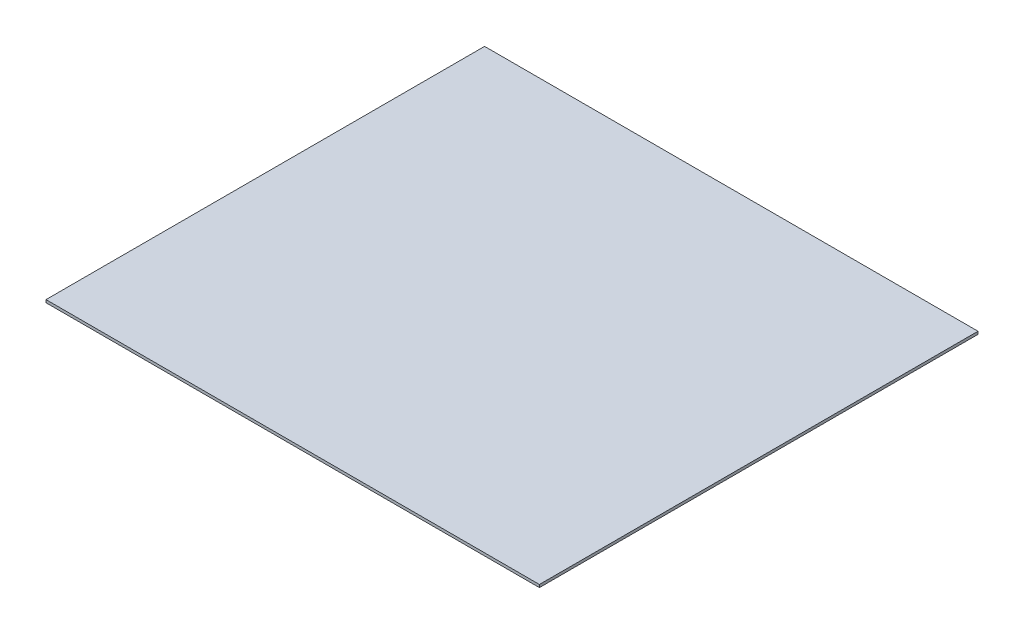
ISO-10303-21;
HEADER;
FILE_DESCRIPTION(('STEP AP214'),'2;1');
FILE_NAME('part.step','',(''),(''),'','','');
FILE_SCHEMA(('AUTOMOTIVE_DESIGN { 1 0 10303 214 1 1 1 1 }'));
ENDSEC;
DATA;
#1=APPLICATION_CONTEXT('core data for automotive mechanical design processes');
#2=APPLICATION_PROTOCOL_DEFINITION('international standard','automotive_design',2000,#1);
#3=PRODUCT_CONTEXT('',#1,'mechanical');
#4=PRODUCT('Part','Part','',(#3));
#5=PRODUCT_RELATED_PRODUCT_CATEGORY('part','',(#4));
#6=PRODUCT_DEFINITION_FORMATION('','',#4);
#7=PRODUCT_DEFINITION_CONTEXT('part definition',#1,'design');
#8=PRODUCT_DEFINITION('design','',#6,#7);
#9=PRODUCT_DEFINITION_SHAPE('','',#8);
#10=(LENGTH_UNIT() NAMED_UNIT(*) SI_UNIT(.MILLI.,.METRE.));
#11=(NAMED_UNIT(*) PLANE_ANGLE_UNIT() SI_UNIT($,.RADIAN.));
#12=(NAMED_UNIT(*) SI_UNIT($,.STERADIAN.) SOLID_ANGLE_UNIT());
#13=UNCERTAINTY_MEASURE_WITH_UNIT(LENGTH_MEASURE(1.E-05),#10,'distance_accuracy_value','');
#14=(GEOMETRIC_REPRESENTATION_CONTEXT(3) GLOBAL_UNCERTAINTY_ASSIGNED_CONTEXT((#13)) GLOBAL_UNIT_ASSIGNED_CONTEXT((#10,
#11,#12)) REPRESENTATION_CONTEXT('',''));
#15=CARTESIAN_POINT('',(0.,0.,0.));
#16=DIRECTION('',(0.,0.,1.));
#17=DIRECTION('',(1.,0.,0.));
#18=AXIS2_PLACEMENT_3D('',#15,#16,#17);
#19=CARTESIAN_POINT('',(-90.,1.,80.));
#20=DIRECTION('',(1.,0.,0.));
#21=DIRECTION('',(0.,0.,-1.));
#22=AXIS2_PLACEMENT_3D('',#19,#20,#21);
#23=PLANE('',#22);
#24=DIRECTION('',(0.,0.,1.));
#25=VECTOR('',#24,1.);
#26=CARTESIAN_POINT('',(-90.,0.,80.));
#27=LINE('',#26,#25);
#28=CARTESIAN_POINT('',(-90.,0.,-80.));
#29=VERTEX_POINT('',#28);
#30=CARTESIAN_POINT('',(-90.,0.,80.));
#31=VERTEX_POINT('',#30);
#32=EDGE_CURVE('E96',#29,#31,#27,.T.);
#33=ORIENTED_EDGE('',*,*,#32,.T.);
#34=DIRECTION('',(0.,-1.,0.));
#35=VECTOR('',#34,1.);
#36=CARTESIAN_POINT('',(-90.,1.,80.));
#37=LINE('',#36,#35);
#38=CARTESIAN_POINT('',(-90.,1.,80.));
#39=VERTEX_POINT('',#38);
#40=EDGE_CURVE('E11',#39,#31,#37,.T.);
#41=ORIENTED_EDGE('',*,*,#40,.F.);
#42=DIRECTION('',(0.,0.,1.));
#43=VECTOR('',#42,1.);
#44=CARTESIAN_POINT('',(-90.,1.,80.));
#45=LINE('',#44,#43);
#46=CARTESIAN_POINT('',(-90.,1.,-80.));
#47=VERTEX_POINT('',#46);
#48=EDGE_CURVE('E84',#47,#39,#45,.T.);
#49=ORIENTED_EDGE('',*,*,#48,.F.);
#50=DIRECTION('',(0.,-1.,0.));
#51=VECTOR('',#50,1.);
#52=CARTESIAN_POINT('',(-90.,1.,-80.));
#53=LINE('',#52,#51);
#54=EDGE_CURVE('E92',#47,#29,#53,.T.);
#55=ORIENTED_EDGE('',*,*,#54,.T.);
#56=EDGE_LOOP('',(#33,#41,#49,#55));
#57=FACE_BOUND('',#56,.T.);
#58=ADVANCED_FACE('F33',(#57),#23,.F.);
#59=CARTESIAN_POINT('',(90.,1.,80.));
#60=DIRECTION('',(0.,0.,-1.));
#61=DIRECTION('',(-1.,0.,0.));
#62=AXIS2_PLACEMENT_3D('',#59,#60,#61);
#63=PLANE('',#62);
#64=DIRECTION('',(1.,0.,0.));
#65=VECTOR('',#64,1.);
#66=CARTESIAN_POINT('',(90.,0.,80.));
#67=LINE('',#66,#65);
#68=CARTESIAN_POINT('',(90.,0.,80.));
#69=VERTEX_POINT('',#68);
#70=EDGE_CURVE('E88',#31,#69,#67,.T.);
#71=ORIENTED_EDGE('',*,*,#70,.T.);
#72=DIRECTION('',(0.,-1.,0.));
#73=VECTOR('',#72,1.);
#74=CARTESIAN_POINT('',(90.,1.,80.));
#75=LINE('',#74,#73);
#76=CARTESIAN_POINT('',(90.,1.,80.));
#77=VERTEX_POINT('',#76);
#78=EDGE_CURVE('E41',#77,#69,#75,.T.);
#79=ORIENTED_EDGE('',*,*,#78,.F.);
#80=DIRECTION('',(1.,0.,0.));
#81=VECTOR('',#80,1.);
#82=CARTESIAN_POINT('',(90.,1.,80.));
#83=LINE('',#82,#81);
#84=EDGE_CURVE('E79',#39,#77,#83,.T.);
#85=ORIENTED_EDGE('',*,*,#84,.F.);
#86=ORIENTED_EDGE('',*,*,#40,.T.);
#87=EDGE_LOOP('',(#71,#79,#85,#86));
#88=FACE_BOUND('',#87,.T.);
#89=ADVANCED_FACE('F87',(#88),#63,.F.);
#90=CARTESIAN_POINT('',(90.,1.,80.));
#91=DIRECTION('',(-1.,0.,0.));
#92=DIRECTION('',(0.,0.,1.));
#93=AXIS2_PLACEMENT_3D('',#90,#91,#92);
#94=PLANE('',#93);
#95=DIRECTION('',(0.,0.,-1.));
#96=VECTOR('',#95,1.);
#97=CARTESIAN_POINT('',(90.,0.,80.));
#98=LINE('',#97,#96);
#99=CARTESIAN_POINT('',(90.,0.,-80.));
#100=VERTEX_POINT('',#99);
#101=EDGE_CURVE('E66',#69,#100,#98,.T.);
#102=ORIENTED_EDGE('',*,*,#101,.T.);
#103=DIRECTION('',(0.,-1.,0.));
#104=VECTOR('',#103,1.);
#105=CARTESIAN_POINT('',(90.,1.,-80.));
#106=LINE('',#105,#104);
#107=CARTESIAN_POINT('',(90.,1.,-80.));
#108=VERTEX_POINT('',#107);
#109=EDGE_CURVE('E89',#108,#100,#106,.T.);
#110=ORIENTED_EDGE('',*,*,#109,.F.);
#111=DIRECTION('',(0.,0.,-1.));
#112=VECTOR('',#111,1.);
#113=CARTESIAN_POINT('',(90.,1.,80.));
#114=LINE('',#113,#112);
#115=EDGE_CURVE('E82',#77,#108,#114,.T.);
#116=ORIENTED_EDGE('',*,*,#115,.F.);
#117=ORIENTED_EDGE('',*,*,#78,.T.);
#118=EDGE_LOOP('',(#102,#110,#116,#117));
#119=FACE_BOUND('',#118,.T.);
#120=ADVANCED_FACE('F90',(#119),#94,.F.);
#121=CARTESIAN_POINT('',(90.,1.,-80.));
#122=DIRECTION('',(0.,0.,1.));
#123=DIRECTION('',(1.,0.,0.));
#124=AXIS2_PLACEMENT_3D('',#121,#122,#123);
#125=PLANE('',#124);
#126=DIRECTION('',(-1.,0.,0.));
#127=VECTOR('',#126,1.);
#128=CARTESIAN_POINT('',(90.,0.,-80.));
#129=LINE('',#128,#127);
#130=EDGE_CURVE('E72',#100,#29,#129,.T.);
#131=ORIENTED_EDGE('',*,*,#130,.T.);
#132=ORIENTED_EDGE('',*,*,#54,.F.);
#133=DIRECTION('',(-1.,0.,0.));
#134=VECTOR('',#133,1.);
#135=CARTESIAN_POINT('',(90.,1.,-80.));
#136=LINE('',#135,#134);
#137=EDGE_CURVE('E49',#108,#47,#136,.T.);
#138=ORIENTED_EDGE('',*,*,#137,.F.);
#139=ORIENTED_EDGE('',*,*,#109,.T.);
#140=EDGE_LOOP('',(#131,#132,#138,#139));
#141=FACE_BOUND('',#140,.T.);
#142=ADVANCED_FACE('F103',(#141),#125,.F.);
#143=CARTESIAN_POINT('',(0.,1.,0.));
#144=DIRECTION('',(0.,1.,0.));
#145=DIRECTION('',(0.,0.,1.));
#146=AXIS2_PLACEMENT_3D('',#143,#144,#145);
#147=PLANE('',#146);
#148=ORIENTED_EDGE('',*,*,#48,.T.);
#149=ORIENTED_EDGE('',*,*,#84,.T.);
#150=ORIENTED_EDGE('',*,*,#115,.T.);
#151=ORIENTED_EDGE('',*,*,#137,.T.);
#152=EDGE_LOOP('',(#148,#149,#150,#151));
#153=FACE_BOUND('',#152,.T.);
#154=ADVANCED_FACE('F80',(#153),#147,.T.);
#155=CARTESIAN_POINT('',(0.,0.,0.));
#156=DIRECTION('',(0.,1.,0.));
#157=DIRECTION('',(0.,0.,1.));
#158=AXIS2_PLACEMENT_3D('',#155,#156,#157);
#159=PLANE('',#158);
#160=ORIENTED_EDGE('',*,*,#32,.F.);
#161=ORIENTED_EDGE('',*,*,#130,.F.);
#162=ORIENTED_EDGE('',*,*,#101,.F.);
#163=ORIENTED_EDGE('',*,*,#70,.F.);
#164=EDGE_LOOP('',(#160,#161,#162,#163));
#165=FACE_BOUND('',#164,.T.);
#166=ADVANCED_FACE('F106',(#165),#159,.F.);
#167=CLOSED_SHELL('',(#58,#89,#120,#142,#154,#166));
#168=MANIFOLD_SOLID_BREP('B2',#167);
#169=ADVANCED_BREP_SHAPE_REPRESENTATION('',(#18,#168),#14);
#170=SHAPE_DEFINITION_REPRESENTATION(#9,#169);
ENDSEC;
END-ISO-10303-21;
